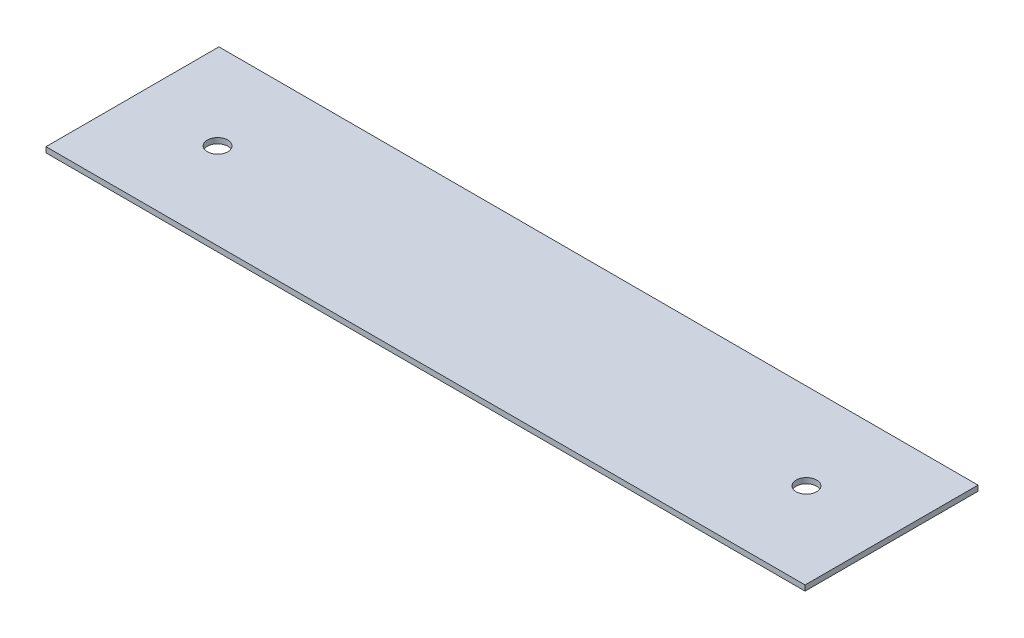
ISO-10303-21;
HEADER;
FILE_DESCRIPTION(('STEP AP214'),'2;1');
FILE_NAME('part.step','',(''),(''),'','','');
FILE_SCHEMA(('AUTOMOTIVE_DESIGN { 1 0 10303 214 1 1 1 1 }'));
ENDSEC;
DATA;
#1=APPLICATION_CONTEXT('core data for automotive mechanical design processes');
#2=APPLICATION_PROTOCOL_DEFINITION('international standard','automotive_design',2000,#1);
#3=PRODUCT_CONTEXT('',#1,'mechanical');
#4=PRODUCT('Part','Part','',(#3));
#5=PRODUCT_RELATED_PRODUCT_CATEGORY('part','',(#4));
#6=PRODUCT_DEFINITION_FORMATION('','',#4);
#7=PRODUCT_DEFINITION_CONTEXT('part definition',#1,'design');
#8=PRODUCT_DEFINITION('design','',#6,#7);
#9=PRODUCT_DEFINITION_SHAPE('','',#8);
#10=(LENGTH_UNIT() NAMED_UNIT(*) SI_UNIT(.MILLI.,.METRE.));
#11=(NAMED_UNIT(*) PLANE_ANGLE_UNIT() SI_UNIT($,.RADIAN.));
#12=(NAMED_UNIT(*) SI_UNIT($,.STERADIAN.) SOLID_ANGLE_UNIT());
#13=UNCERTAINTY_MEASURE_WITH_UNIT(LENGTH_MEASURE(1.E-05),#10,'distance_accuracy_value','');
#14=(GEOMETRIC_REPRESENTATION_CONTEXT(3) GLOBAL_UNCERTAINTY_ASSIGNED_CONTEXT((#13)) GLOBAL_UNIT_ASSIGNED_CONTEXT((#10,
#11,#12)) REPRESENTATION_CONTEXT('',''));
#15=CARTESIAN_POINT('',(0.,0.,0.));
#16=DIRECTION('',(0.,0.,1.));
#17=DIRECTION('',(1.,0.,0.));
#18=AXIS2_PLACEMENT_3D('',#15,#16,#17);
#19=CARTESIAN_POINT('',(446.,3.175,0.));
#20=DIRECTION('',(0.,0.,-1.));
#21=DIRECTION('',(-1.,0.,0.));
#22=AXIS2_PLACEMENT_3D('',#19,#20,#21);
#23=PLANE('',#22);
#24=DIRECTION('',(1.,0.,0.));
#25=VECTOR('',#24,1.);
#26=CARTESIAN_POINT('',(446.,0.,0.));
#27=LINE('',#26,#25);
#28=CARTESIAN_POINT('',(0.,0.,0.));
#29=VERTEX_POINT('',#28);
#30=CARTESIAN_POINT('',(446.,0.,0.));
#31=VERTEX_POINT('',#30);
#32=EDGE_CURVE('E109',#29,#31,#27,.T.);
#33=ORIENTED_EDGE('',*,*,#32,.T.);
#34=DIRECTION('',(0.,-1.,0.));
#35=VECTOR('',#34,1.);
#36=CARTESIAN_POINT('',(446.,3.175,0.));
#37=LINE('',#36,#35);
#38=CARTESIAN_POINT('',(446.,3.175,0.));
#39=VERTEX_POINT('',#38);
#40=EDGE_CURVE('E11',#39,#31,#37,.T.);
#41=ORIENTED_EDGE('',*,*,#40,.F.);
#42=DIRECTION('',(1.,0.,0.));
#43=VECTOR('',#42,1.);
#44=CARTESIAN_POINT('',(446.,3.175,0.));
#45=LINE('',#44,#43);
#46=CARTESIAN_POINT('',(0.,3.175,0.));
#47=VERTEX_POINT('',#46);
#48=EDGE_CURVE('E96',#47,#39,#45,.T.);
#49=ORIENTED_EDGE('',*,*,#48,.F.);
#50=DIRECTION('',(0.,-1.,0.));
#51=VECTOR('',#50,1.);
#52=CARTESIAN_POINT('',(0.,3.175,0.));
#53=LINE('',#52,#51);
#54=EDGE_CURVE('E105',#47,#29,#53,.T.);
#55=ORIENTED_EDGE('',*,*,#54,.T.);
#56=EDGE_LOOP('',(#33,#41,#49,#55));
#57=FACE_BOUND('',#56,.T.);
#58=ADVANCED_FACE('F43',(#57),#23,.F.);
#59=CARTESIAN_POINT('',(446.,3.175,-101.6));
#60=DIRECTION('',(-1.,0.,0.));
#61=DIRECTION('',(0.,0.,1.));
#62=AXIS2_PLACEMENT_3D('',#59,#60,#61);
#63=PLANE('',#62);
#64=DIRECTION('',(0.,0.,-1.));
#65=VECTOR('',#64,1.);
#66=CARTESIAN_POINT('',(446.,0.,-101.6));
#67=LINE('',#66,#65);
#68=CARTESIAN_POINT('',(446.,0.,-101.6));
#69=VERTEX_POINT('',#68);
#70=EDGE_CURVE('E100',#31,#69,#67,.T.);
#71=ORIENTED_EDGE('',*,*,#70,.T.);
#72=DIRECTION('',(0.,-1.,0.));
#73=VECTOR('',#72,1.);
#74=CARTESIAN_POINT('',(446.,3.175,-101.6));
#75=LINE('',#74,#73);
#76=CARTESIAN_POINT('',(446.,3.175,-101.6));
#77=VERTEX_POINT('',#76);
#78=EDGE_CURVE('E52',#77,#69,#75,.T.);
#79=ORIENTED_EDGE('',*,*,#78,.F.);
#80=DIRECTION('',(0.,0.,-1.));
#81=VECTOR('',#80,1.);
#82=CARTESIAN_POINT('',(446.,3.175,-101.6));
#83=LINE('',#82,#81);
#84=EDGE_CURVE('E91',#39,#77,#83,.T.);
#85=ORIENTED_EDGE('',*,*,#84,.F.);
#86=ORIENTED_EDGE('',*,*,#40,.T.);
#87=EDGE_LOOP('',(#71,#79,#85,#86));
#88=FACE_BOUND('',#87,.T.);
#89=ADVANCED_FACE('F99',(#88),#63,.F.);
#90=CARTESIAN_POINT('',(0.,3.175,-101.6));
#91=DIRECTION('',(0.,0.,1.));
#92=DIRECTION('',(1.,0.,0.));
#93=AXIS2_PLACEMENT_3D('',#90,#91,#92);
#94=PLANE('',#93);
#95=DIRECTION('',(-1.,0.,0.));
#96=VECTOR('',#95,1.);
#97=CARTESIAN_POINT('',(0.,0.,-101.6));
#98=LINE('',#97,#96);
#99=CARTESIAN_POINT('',(0.,0.,-101.6));
#100=VERTEX_POINT('',#99);
#101=EDGE_CURVE('E78',#69,#100,#98,.T.);
#102=ORIENTED_EDGE('',*,*,#101,.T.);
#103=DIRECTION('',(0.,-1.,0.));
#104=VECTOR('',#103,1.);
#105=CARTESIAN_POINT('',(0.,3.175,-101.6));
#106=LINE('',#105,#104);
#107=CARTESIAN_POINT('',(0.,3.175,-101.6));
#108=VERTEX_POINT('',#107);
#109=EDGE_CURVE('E101',#108,#100,#106,.T.);
#110=ORIENTED_EDGE('',*,*,#109,.F.);
#111=DIRECTION('',(-1.,0.,0.));
#112=VECTOR('',#111,1.);
#113=CARTESIAN_POINT('',(0.,3.175,-101.6));
#114=LINE('',#113,#112);
#115=EDGE_CURVE('E94',#77,#108,#114,.T.);
#116=ORIENTED_EDGE('',*,*,#115,.F.);
#117=ORIENTED_EDGE('',*,*,#78,.T.);
#118=EDGE_LOOP('',(#102,#110,#116,#117));
#119=FACE_BOUND('',#118,.T.);
#120=ADVANCED_FACE('F103',(#119),#94,.F.);
#121=CARTESIAN_POINT('',(0.,3.175,0.));
#122=DIRECTION('',(1.,0.,0.));
#123=DIRECTION('',(0.,0.,-1.));
#124=AXIS2_PLACEMENT_3D('',#121,#122,#123);
#125=PLANE('',#124);
#126=DIRECTION('',(0.,0.,1.));
#127=VECTOR('',#126,1.);
#128=CARTESIAN_POINT('',(0.,0.,0.));
#129=LINE('',#128,#127);
#130=EDGE_CURVE('E84',#100,#29,#129,.T.);
#131=ORIENTED_EDGE('',*,*,#130,.T.);
#132=ORIENTED_EDGE('',*,*,#54,.F.);
#133=DIRECTION('',(0.,0.,1.));
#134=VECTOR('',#133,1.);
#135=CARTESIAN_POINT('',(0.,3.175,0.));
#136=LINE('',#135,#134);
#137=EDGE_CURVE('E61',#108,#47,#136,.T.);
#138=ORIENTED_EDGE('',*,*,#137,.F.);
#139=ORIENTED_EDGE('',*,*,#109,.T.);
#140=EDGE_LOOP('',(#131,#132,#138,#139));
#141=FACE_BOUND('',#140,.T.);
#142=ADVANCED_FACE('F135',(#141),#125,.F.);
#143=CARTESIAN_POINT('',(0.,3.175,0.));
#144=DIRECTION('',(0.,-1.,0.));
#145=DIRECTION('',(0.,0.,-1.));
#146=AXIS2_PLACEMENT_3D('',#143,#144,#145);
#147=PLANE('',#146);
#148=CARTESIAN_POINT('',(396.,3.175,-50.8));
#149=DIRECTION('',(0.,1.,0.));
#150=DIRECTION('',(0.,0.,1.));
#151=AXIS2_PLACEMENT_3D('',#148,#149,#150);
#152=CIRCLE('',#151,5.99999999999999);
#153=CARTESIAN_POINT('',(396.,3.175,-44.8));
#154=VERTEX_POINT('',#153);
#155=EDGE_CURVE('E118',#154,#154,#152,.T.);
#156=ORIENTED_EDGE('',*,*,#155,.F.);
#157=EDGE_LOOP('',(#156));
#158=FACE_BOUND('',#157,.T.);
#159=CARTESIAN_POINT('',(50.,3.175,-50.8));
#160=DIRECTION('',(0.,1.,0.));
#161=DIRECTION('',(0.,0.,1.));
#162=AXIS2_PLACEMENT_3D('',#159,#160,#161);
#163=CIRCLE('',#162,6.);
#164=CARTESIAN_POINT('',(50.,3.175,-44.8));
#165=VERTEX_POINT('',#164);
#166=EDGE_CURVE('E123',#165,#165,#163,.T.);
#167=ORIENTED_EDGE('',*,*,#166,.F.);
#168=EDGE_LOOP('',(#167));
#169=FACE_BOUND('',#168,.T.);
#170=ORIENTED_EDGE('',*,*,#48,.T.);
#171=ORIENTED_EDGE('',*,*,#84,.T.);
#172=ORIENTED_EDGE('',*,*,#115,.T.);
#173=ORIENTED_EDGE('',*,*,#137,.T.);
#174=EDGE_LOOP('',(#170,#171,#172,#173));
#175=FACE_BOUND('',#174,.T.);
#176=ADVANCED_FACE('F92',(#158,#169,#175),#147,.F.);
#177=CARTESIAN_POINT('',(0.,0.,0.));
#178=DIRECTION('',(0.,-1.,0.));
#179=DIRECTION('',(0.,0.,-1.));
#180=AXIS2_PLACEMENT_3D('',#177,#178,#179);
#181=PLANE('',#180);
#182=CARTESIAN_POINT('',(396.,0.,-50.8));
#183=DIRECTION('',(0.,-1.,0.));
#184=DIRECTION('',(0.,0.,-1.));
#185=AXIS2_PLACEMENT_3D('',#182,#183,#184);
#186=CIRCLE('',#185,5.99999999999999);
#187=CARTESIAN_POINT('',(396.,0.,-56.8));
#188=VERTEX_POINT('',#187);
#189=EDGE_CURVE('E46',#188,#188,#186,.T.);
#190=ORIENTED_EDGE('',*,*,#189,.F.);
#191=EDGE_LOOP('',(#190));
#192=FACE_BOUND('',#191,.T.);
#193=CARTESIAN_POINT('',(50.,0.,-50.8));
#194=DIRECTION('',(0.,-1.,0.));
#195=DIRECTION('',(0.,0.,-1.));
#196=AXIS2_PLACEMENT_3D('',#193,#194,#195);
#197=CIRCLE('',#196,6.);
#198=CARTESIAN_POINT('',(50.,0.,-56.8));
#199=VERTEX_POINT('',#198);
#200=EDGE_CURVE('E116',#199,#199,#197,.T.);
#201=ORIENTED_EDGE('',*,*,#200,.F.);
#202=EDGE_LOOP('',(#201));
#203=FACE_BOUND('',#202,.T.);
#204=ORIENTED_EDGE('',*,*,#32,.F.);
#205=ORIENTED_EDGE('',*,*,#130,.F.);
#206=ORIENTED_EDGE('',*,*,#101,.F.);
#207=ORIENTED_EDGE('',*,*,#70,.F.);
#208=EDGE_LOOP('',(#204,#205,#206,#207));
#209=FACE_BOUND('',#208,.T.);
#210=ADVANCED_FACE('F134',(#192,#203,#209),#181,.T.);
#211=CARTESIAN_POINT('',(50.,-6.825,-50.8));
#212=DIRECTION('',(0.,1.,0.));
#213=DIRECTION('',(0.,0.,1.));
#214=AXIS2_PLACEMENT_3D('',#211,#212,#213);
#215=CYLINDRICAL_SURFACE('',#214,6.);
#216=ORIENTED_EDGE('',*,*,#200,.T.);
#217=EDGE_LOOP('',(#216));
#218=FACE_BOUND('',#217,.T.);
#219=ORIENTED_EDGE('',*,*,#166,.T.);
#220=EDGE_LOOP('',(#219));
#221=FACE_BOUND('',#220,.T.);
#222=ADVANCED_FACE('F131',(#218,#221),#215,.F.);
#223=CARTESIAN_POINT('',(396.,-6.825,-50.8));
#224=DIRECTION('',(0.,1.,0.));
#225=DIRECTION('',(0.,0.,1.));
#226=AXIS2_PLACEMENT_3D('',#223,#224,#225);
#227=CYLINDRICAL_SURFACE('',#226,5.99999999999999);
#228=ORIENTED_EDGE('',*,*,#189,.T.);
#229=EDGE_LOOP('',(#228));
#230=FACE_BOUND('',#229,.T.);
#231=ORIENTED_EDGE('',*,*,#155,.T.);
#232=EDGE_LOOP('',(#231));
#233=FACE_BOUND('',#232,.T.);
#234=ADVANCED_FACE('F184',(#230,#233),#227,.F.);
#235=CLOSED_SHELL('',(#58,#89,#120,#142,#176,#210,#222,#234));
#236=MANIFOLD_SOLID_BREP('B2',#235);
#237=ADVANCED_BREP_SHAPE_REPRESENTATION('',(#18,#236),#14);
#238=SHAPE_DEFINITION_REPRESENTATION(#9,#237);
ENDSEC;
END-ISO-10303-21;
